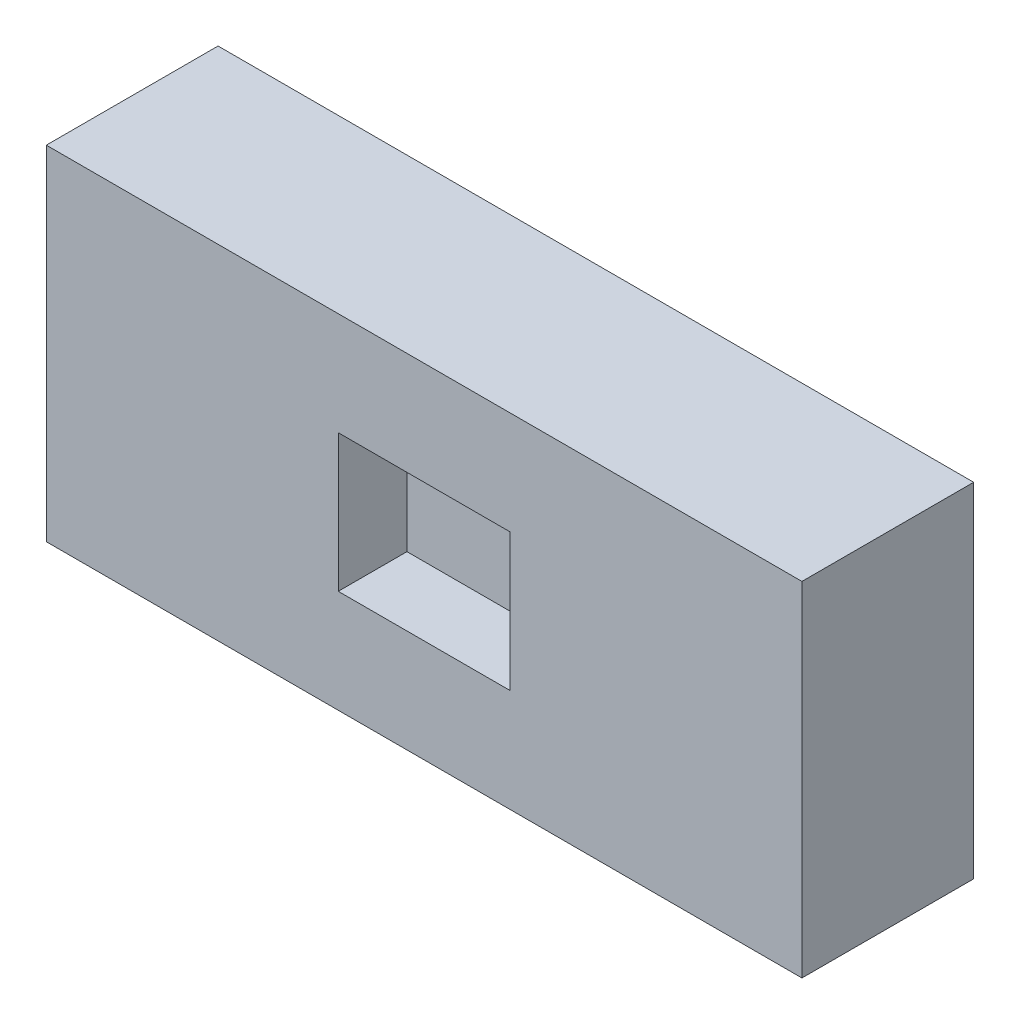
ISO-10303-21;
HEADER;
FILE_DESCRIPTION(('STEP AP214'),'2;1');
FILE_NAME('part.step','',(''),(''),'','','');
FILE_SCHEMA(('AUTOMOTIVE_DESIGN { 1 0 10303 214 1 1 1 1 }'));
ENDSEC;
DATA;
#1=APPLICATION_CONTEXT('core data for automotive mechanical design processes');
#2=APPLICATION_PROTOCOL_DEFINITION('international standard','automotive_design',2000,#1);
#3=PRODUCT_CONTEXT('',#1,'mechanical');
#4=PRODUCT('Part','Part','',(#3));
#5=PRODUCT_RELATED_PRODUCT_CATEGORY('part','',(#4));
#6=PRODUCT_DEFINITION_FORMATION('','',#4);
#7=PRODUCT_DEFINITION_CONTEXT('part definition',#1,'design');
#8=PRODUCT_DEFINITION('design','',#6,#7);
#9=PRODUCT_DEFINITION_SHAPE('','',#8);
#10=(LENGTH_UNIT() NAMED_UNIT(*) SI_UNIT(.MILLI.,.METRE.));
#11=(NAMED_UNIT(*) PLANE_ANGLE_UNIT() SI_UNIT($,.RADIAN.));
#12=(NAMED_UNIT(*) SI_UNIT($,.STERADIAN.) SOLID_ANGLE_UNIT());
#13=UNCERTAINTY_MEASURE_WITH_UNIT(LENGTH_MEASURE(1.E-05),#10,'distance_accuracy_value','');
#14=(GEOMETRIC_REPRESENTATION_CONTEXT(3) GLOBAL_UNCERTAINTY_ASSIGNED_CONTEXT((#13)) GLOBAL_UNIT_ASSIGNED_CONTEXT((#10,
#11,#12)) REPRESENTATION_CONTEXT('',''));
#15=CARTESIAN_POINT('',(0.,0.,0.));
#16=DIRECTION('',(0.,0.,1.));
#17=DIRECTION('',(1.,0.,0.));
#18=AXIS2_PLACEMENT_3D('',#15,#16,#17);
#19=CARTESIAN_POINT('',(0.,0.,10.));
#20=DIRECTION('',(1.,0.,0.));
#21=DIRECTION('',(0.,0.,-1.));
#22=AXIS2_PLACEMENT_3D('',#19,#20,#21);
#23=PLANE('',#22);
#24=DIRECTION('',(0.,-1.,0.));
#25=VECTOR('',#24,1.);
#26=CARTESIAN_POINT('',(0.,0.,0.));
#27=LINE('',#26,#25);
#28=CARTESIAN_POINT('',(0.,20.,0.));
#29=VERTEX_POINT('',#28);
#30=CARTESIAN_POINT('',(0.,0.,0.));
#31=VERTEX_POINT('',#30);
#32=EDGE_CURVE('E153',#29,#31,#27,.T.);
#33=ORIENTED_EDGE('',*,*,#32,.T.);
#34=DIRECTION('',(0.,0.,-1.));
#35=VECTOR('',#34,1.);
#36=CARTESIAN_POINT('',(0.,0.,10.));
#37=LINE('',#36,#35);
#38=CARTESIAN_POINT('',(0.,0.,10.));
#39=VERTEX_POINT('',#38);
#40=EDGE_CURVE('E11',#39,#31,#37,.T.);
#41=ORIENTED_EDGE('',*,*,#40,.F.);
#42=DIRECTION('',(0.,-1.,0.));
#43=VECTOR('',#42,1.);
#44=CARTESIAN_POINT('',(0.,0.,10.));
#45=LINE('',#44,#43);
#46=CARTESIAN_POINT('',(0.,20.,10.));
#47=VERTEX_POINT('',#46);
#48=EDGE_CURVE('E160',#47,#39,#45,.T.);
#49=ORIENTED_EDGE('',*,*,#48,.F.);
#50=DIRECTION('',(0.,0.,-1.));
#51=VECTOR('',#50,1.);
#52=CARTESIAN_POINT('',(0.,20.,10.));
#53=LINE('',#52,#51);
#54=EDGE_CURVE('E162',#47,#29,#53,.T.);
#55=ORIENTED_EDGE('',*,*,#54,.T.);
#56=EDGE_LOOP('',(#33,#41,#49,#55));
#57=FACE_BOUND('',#56,.T.);
#58=ADVANCED_FACE('F44',(#57),#23,.F.);
#59=CARTESIAN_POINT('',(0.,0.,10.));
#60=DIRECTION('',(0.,1.,0.));
#61=DIRECTION('',(0.,0.,1.));
#62=AXIS2_PLACEMENT_3D('',#59,#60,#61);
#63=PLANE('',#62);
#64=DIRECTION('',(1.,0.,0.));
#65=VECTOR('',#64,1.);
#66=CARTESIAN_POINT('',(0.,0.,0.));
#67=LINE('',#66,#65);
#68=CARTESIAN_POINT('',(44.,0.,0.));
#69=VERTEX_POINT('',#68);
#70=EDGE_CURVE('E167',#31,#69,#67,.T.);
#71=ORIENTED_EDGE('',*,*,#70,.T.);
#72=DIRECTION('',(0.,0.,-1.));
#73=VECTOR('',#72,1.);
#74=CARTESIAN_POINT('',(44.,0.,10.));
#75=LINE('',#74,#73);
#76=CARTESIAN_POINT('',(44.,0.,10.));
#77=VERTEX_POINT('',#76);
#78=EDGE_CURVE('E55',#77,#69,#75,.T.);
#79=ORIENTED_EDGE('',*,*,#78,.F.);
#80=DIRECTION('',(1.,0.,0.));
#81=VECTOR('',#80,1.);
#82=CARTESIAN_POINT('',(0.,0.,10.));
#83=LINE('',#82,#81);
#84=EDGE_CURVE('E96',#39,#77,#83,.T.);
#85=ORIENTED_EDGE('',*,*,#84,.F.);
#86=ORIENTED_EDGE('',*,*,#40,.T.);
#87=EDGE_LOOP('',(#71,#79,#85,#86));
#88=FACE_BOUND('',#87,.T.);
#89=ADVANCED_FACE('F198',(#88),#63,.F.);
#90=CARTESIAN_POINT('',(44.,0.,10.));
#91=DIRECTION('',(-1.,0.,0.));
#92=DIRECTION('',(0.,0.,1.));
#93=AXIS2_PLACEMENT_3D('',#90,#91,#92);
#94=PLANE('',#93);
#95=DIRECTION('',(0.,1.,0.));
#96=VECTOR('',#95,1.);
#97=CARTESIAN_POINT('',(44.,0.,0.));
#98=LINE('',#97,#96);
#99=CARTESIAN_POINT('',(44.,20.,0.));
#100=VERTEX_POINT('',#99);
#101=EDGE_CURVE('E169',#69,#100,#98,.T.);
#102=ORIENTED_EDGE('',*,*,#101,.T.);
#103=DIRECTION('',(0.,0.,-1.));
#104=VECTOR('',#103,1.);
#105=CARTESIAN_POINT('',(44.,20.,10.));
#106=LINE('',#105,#104);
#107=CARTESIAN_POINT('',(44.,20.,10.));
#108=VERTEX_POINT('',#107);
#109=EDGE_CURVE('E171',#108,#100,#106,.T.);
#110=ORIENTED_EDGE('',*,*,#109,.F.);
#111=DIRECTION('',(0.,1.,0.));
#112=VECTOR('',#111,1.);
#113=CARTESIAN_POINT('',(44.,0.,10.));
#114=LINE('',#113,#112);
#115=EDGE_CURVE('E159',#77,#108,#114,.T.);
#116=ORIENTED_EDGE('',*,*,#115,.F.);
#117=ORIENTED_EDGE('',*,*,#78,.T.);
#118=EDGE_LOOP('',(#102,#110,#116,#117));
#119=FACE_BOUND('',#118,.T.);
#120=ADVANCED_FACE('F177',(#119),#94,.F.);
#121=CARTESIAN_POINT('',(0.,20.,10.));
#122=DIRECTION('',(0.,-1.,0.));
#123=DIRECTION('',(0.,0.,-1.));
#124=AXIS2_PLACEMENT_3D('',#121,#122,#123);
#125=PLANE('',#124);
#126=DIRECTION('',(-1.,0.,0.));
#127=VECTOR('',#126,1.);
#128=CARTESIAN_POINT('',(0.,20.,0.));
#129=LINE('',#128,#127);
#130=EDGE_CURVE('E90',#100,#29,#129,.T.);
#131=ORIENTED_EDGE('',*,*,#130,.T.);
#132=ORIENTED_EDGE('',*,*,#54,.F.);
#133=DIRECTION('',(-1.,0.,0.));
#134=VECTOR('',#133,1.);
#135=CARTESIAN_POINT('',(0.,20.,10.));
#136=LINE('',#135,#134);
#137=EDGE_CURVE('E69',#108,#47,#136,.T.);
#138=ORIENTED_EDGE('',*,*,#137,.F.);
#139=ORIENTED_EDGE('',*,*,#109,.T.);
#140=EDGE_LOOP('',(#131,#132,#138,#139));
#141=FACE_BOUND('',#140,.T.);
#142=ADVANCED_FACE('F183',(#141),#125,.F.);
#143=CARTESIAN_POINT('',(0.,0.,10.));
#144=DIRECTION('',(0.,0.,-1.));
#145=DIRECTION('',(-1.,0.,0.));
#146=AXIS2_PLACEMENT_3D('',#143,#144,#145);
#147=PLANE('',#146);
#148=DIRECTION('',(1.,0.,0.));
#149=VECTOR('',#148,1.);
#150=CARTESIAN_POINT('',(17.,6.,10.));
#151=LINE('',#150,#149);
#152=CARTESIAN_POINT('',(17.,6.,10.));
#153=VERTEX_POINT('',#152);
#154=CARTESIAN_POINT('',(27.,6.,10.));
#155=VERTEX_POINT('',#154);
#156=EDGE_CURVE('E150',#153,#155,#151,.T.);
#157=ORIENTED_EDGE('',*,*,#156,.F.);
#158=DIRECTION('',(0.,-1.,0.));
#159=VECTOR('',#158,1.);
#160=CARTESIAN_POINT('',(17.,6.,10.));
#161=LINE('',#160,#159);
#162=CARTESIAN_POINT('',(17.,14.,10.));
#163=VERTEX_POINT('',#162);
#164=EDGE_CURVE('E56',#163,#153,#161,.T.);
#165=ORIENTED_EDGE('',*,*,#164,.F.);
#166=DIRECTION('',(-1.,0.,0.));
#167=VECTOR('',#166,1.);
#168=CARTESIAN_POINT('',(17.,14.,10.));
#169=LINE('',#168,#167);
#170=CARTESIAN_POINT('',(27.,14.,10.));
#171=VERTEX_POINT('',#170);
#172=EDGE_CURVE('E139',#171,#163,#169,.T.);
#173=ORIENTED_EDGE('',*,*,#172,.F.);
#174=DIRECTION('',(0.,1.,0.));
#175=VECTOR('',#174,1.);
#176=CARTESIAN_POINT('',(27.,6.,10.));
#177=LINE('',#176,#175);
#178=EDGE_CURVE('E143',#155,#171,#177,.T.);
#179=ORIENTED_EDGE('',*,*,#178,.F.);
#180=EDGE_LOOP('',(#157,#165,#173,#179));
#181=FACE_BOUND('',#180,.T.);
#182=ORIENTED_EDGE('',*,*,#48,.T.);
#183=ORIENTED_EDGE('',*,*,#84,.T.);
#184=ORIENTED_EDGE('',*,*,#115,.T.);
#185=ORIENTED_EDGE('',*,*,#137,.T.);
#186=EDGE_LOOP('',(#182,#183,#184,#185));
#187=FACE_BOUND('',#186,.T.);
#188=ADVANCED_FACE('F186',(#181,#187),#147,.F.);
#189=CARTESIAN_POINT('',(0.,0.,0.));
#190=DIRECTION('',(0.,0.,-1.));
#191=DIRECTION('',(-1.,0.,0.));
#192=AXIS2_PLACEMENT_3D('',#189,#190,#191);
#193=PLANE('',#192);
#194=ORIENTED_EDGE('',*,*,#32,.F.);
#195=ORIENTED_EDGE('',*,*,#130,.F.);
#196=ORIENTED_EDGE('',*,*,#101,.F.);
#197=ORIENTED_EDGE('',*,*,#70,.F.);
#198=EDGE_LOOP('',(#194,#195,#196,#197));
#199=FACE_BOUND('',#198,.T.);
#200=ADVANCED_FACE('F182',(#199),#193,.T.);
#201=CARTESIAN_POINT('',(17.,6.,6.));
#202=DIRECTION('',(-1.,0.,0.));
#203=DIRECTION('',(0.,0.,1.));
#204=AXIS2_PLACEMENT_3D('',#201,#202,#203);
#205=PLANE('',#204);
#206=ORIENTED_EDGE('',*,*,#164,.T.);
#207=DIRECTION('',(0.,0.,1.));
#208=VECTOR('',#207,1.);
#209=CARTESIAN_POINT('',(17.,6.,6.));
#210=LINE('',#209,#208);
#211=CARTESIAN_POINT('',(17.,6.,6.));
#212=VERTEX_POINT('',#211);
#213=EDGE_CURVE('E119',#212,#153,#210,.T.);
#214=ORIENTED_EDGE('',*,*,#213,.F.);
#215=DIRECTION('',(0.,-1.,0.));
#216=VECTOR('',#215,1.);
#217=CARTESIAN_POINT('',(17.,6.,6.));
#218=LINE('',#217,#216);
#219=CARTESIAN_POINT('',(17.,14.,6.));
#220=VERTEX_POINT('',#219);
#221=EDGE_CURVE('E117',#220,#212,#218,.T.);
#222=ORIENTED_EDGE('',*,*,#221,.F.);
#223=DIRECTION('',(0.,0.,1.));
#224=VECTOR('',#223,1.);
#225=CARTESIAN_POINT('',(17.,14.,6.));
#226=LINE('',#225,#224);
#227=EDGE_CURVE('E151',#220,#163,#226,.T.);
#228=ORIENTED_EDGE('',*,*,#227,.T.);
#229=EDGE_LOOP('',(#206,#214,#222,#228));
#230=FACE_BOUND('',#229,.T.);
#231=ADVANCED_FACE('F120',(#230),#205,.F.);
#232=CARTESIAN_POINT('',(17.,14.,6.));
#233=DIRECTION('',(0.,1.,0.));
#234=DIRECTION('',(0.,0.,1.));
#235=AXIS2_PLACEMENT_3D('',#232,#233,#234);
#236=PLANE('',#235);
#237=ORIENTED_EDGE('',*,*,#172,.T.);
#238=ORIENTED_EDGE('',*,*,#227,.F.);
#239=DIRECTION('',(-1.,0.,0.));
#240=VECTOR('',#239,1.);
#241=CARTESIAN_POINT('',(17.,14.,6.));
#242=LINE('',#241,#240);
#243=CARTESIAN_POINT('',(27.,14.,6.));
#244=VERTEX_POINT('',#243);
#245=EDGE_CURVE('E127',#244,#220,#242,.T.);
#246=ORIENTED_EDGE('',*,*,#245,.F.);
#247=DIRECTION('',(0.,0.,1.));
#248=VECTOR('',#247,1.);
#249=CARTESIAN_POINT('',(27.,14.,6.));
#250=LINE('',#249,#248);
#251=EDGE_CURVE('E152',#244,#171,#250,.T.);
#252=ORIENTED_EDGE('',*,*,#251,.T.);
#253=EDGE_LOOP('',(#237,#238,#246,#252));
#254=FACE_BOUND('',#253,.T.);
#255=ADVANCED_FACE('F240',(#254),#236,.F.);
#256=CARTESIAN_POINT('',(27.,6.,6.));
#257=DIRECTION('',(1.,0.,0.));
#258=DIRECTION('',(0.,0.,-1.));
#259=AXIS2_PLACEMENT_3D('',#256,#257,#258);
#260=PLANE('',#259);
#261=ORIENTED_EDGE('',*,*,#178,.T.);
#262=ORIENTED_EDGE('',*,*,#251,.F.);
#263=DIRECTION('',(0.,1.,0.));
#264=VECTOR('',#263,1.);
#265=CARTESIAN_POINT('',(27.,6.,6.));
#266=LINE('',#265,#264);
#267=CARTESIAN_POINT('',(27.,6.,6.));
#268=VERTEX_POINT('',#267);
#269=EDGE_CURVE('E133',#268,#244,#266,.T.);
#270=ORIENTED_EDGE('',*,*,#269,.F.);
#271=DIRECTION('',(0.,0.,1.));
#272=VECTOR('',#271,1.);
#273=CARTESIAN_POINT('',(27.,6.,6.));
#274=LINE('',#273,#272);
#275=EDGE_CURVE('E125',#268,#155,#274,.T.);
#276=ORIENTED_EDGE('',*,*,#275,.T.);
#277=EDGE_LOOP('',(#261,#262,#270,#276));
#278=FACE_BOUND('',#277,.T.);
#279=ADVANCED_FACE('F246',(#278),#260,.F.);
#280=CARTESIAN_POINT('',(17.,6.,6.));
#281=DIRECTION('',(0.,-1.,0.));
#282=DIRECTION('',(0.,0.,-1.));
#283=AXIS2_PLACEMENT_3D('',#280,#281,#282);
#284=PLANE('',#283);
#285=ORIENTED_EDGE('',*,*,#156,.T.);
#286=ORIENTED_EDGE('',*,*,#275,.F.);
#287=DIRECTION('',(1.,0.,0.));
#288=VECTOR('',#287,1.);
#289=CARTESIAN_POINT('',(17.,6.,6.));
#290=LINE('',#289,#288);
#291=EDGE_CURVE('E129',#212,#268,#290,.T.);
#292=ORIENTED_EDGE('',*,*,#291,.F.);
#293=ORIENTED_EDGE('',*,*,#213,.T.);
#294=EDGE_LOOP('',(#285,#286,#292,#293));
#295=FACE_BOUND('',#294,.T.);
#296=ADVANCED_FACE('F128',(#295),#284,.F.);
#297=CARTESIAN_POINT('',(0.,0.,6.));
#298=DIRECTION('',(0.,0.,-1.));
#299=DIRECTION('',(-1.,0.,0.));
#300=AXIS2_PLACEMENT_3D('',#297,#298,#299);
#301=PLANE('',#300);
#302=ORIENTED_EDGE('',*,*,#221,.T.);
#303=ORIENTED_EDGE('',*,*,#291,.T.);
#304=ORIENTED_EDGE('',*,*,#269,.T.);
#305=ORIENTED_EDGE('',*,*,#245,.T.);
#306=EDGE_LOOP('',(#302,#303,#304,#305));
#307=FACE_BOUND('',#306,.T.);
#308=ADVANCED_FACE('F136',(#307),#301,.F.);
#309=CLOSED_SHELL('',(#58,#89,#120,#142,#188,#200,#231,#255,#279,#296,#308));
#310=MANIFOLD_SOLID_BREP('B2',#309);
#311=ADVANCED_BREP_SHAPE_REPRESENTATION('',(#18,#310),#14);
#312=SHAPE_DEFINITION_REPRESENTATION(#9,#311);
ENDSEC;
END-ISO-10303-21;
